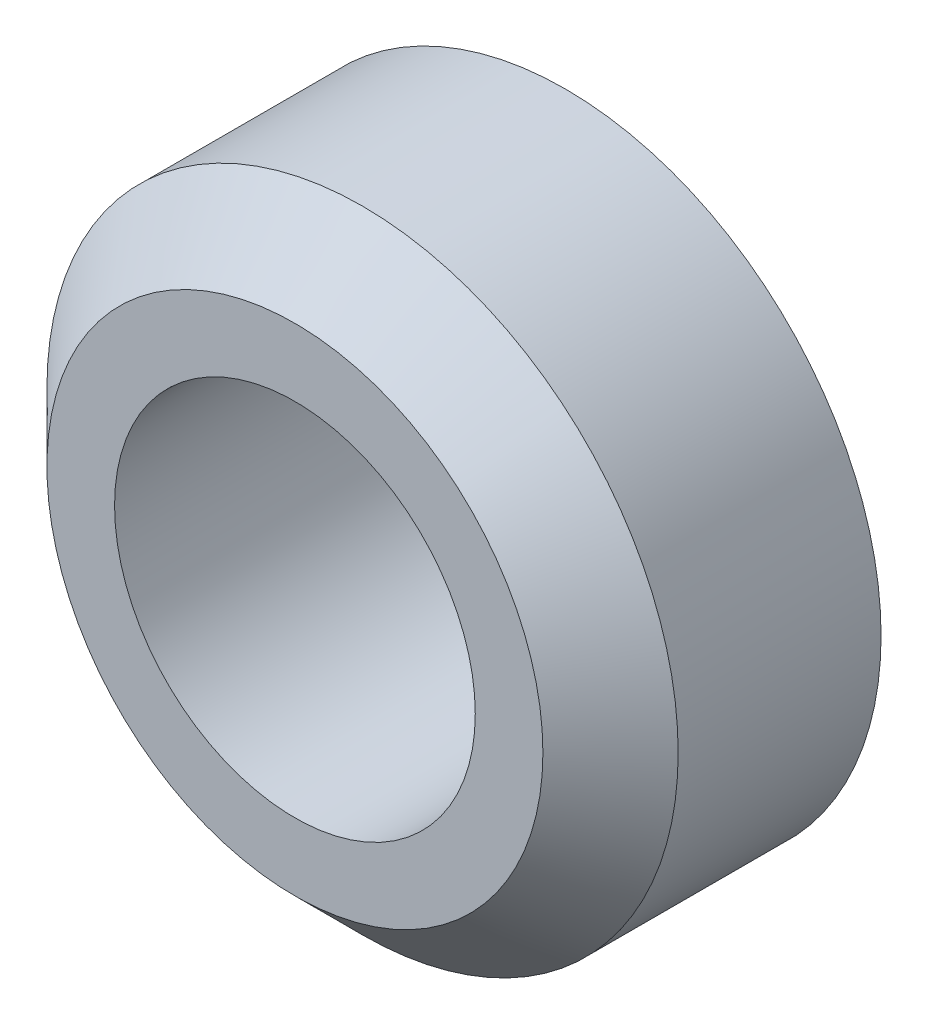
ISO-10303-21;
HEADER;
FILE_DESCRIPTION(('STEP AP214'),'2;1');
FILE_NAME('part.step','',(''),(''),'','','');
FILE_SCHEMA(('AUTOMOTIVE_DESIGN { 1 0 10303 214 1 1 1 1 }'));
ENDSEC;
DATA;
#1=APPLICATION_CONTEXT('core data for automotive mechanical design processes');
#2=APPLICATION_PROTOCOL_DEFINITION('international standard','automotive_design',2000,#1);
#3=PRODUCT_CONTEXT('',#1,'mechanical');
#4=PRODUCT('Part','Part','',(#3));
#5=PRODUCT_RELATED_PRODUCT_CATEGORY('part','',(#4));
#6=PRODUCT_DEFINITION_FORMATION('','',#4);
#7=PRODUCT_DEFINITION_CONTEXT('part definition',#1,'design');
#8=PRODUCT_DEFINITION('design','',#6,#7);
#9=PRODUCT_DEFINITION_SHAPE('','',#8);
#10=(LENGTH_UNIT() NAMED_UNIT(*) SI_UNIT(.MILLI.,.METRE.));
#11=(NAMED_UNIT(*) PLANE_ANGLE_UNIT() SI_UNIT($,.RADIAN.));
#12=(NAMED_UNIT(*) SI_UNIT($,.STERADIAN.) SOLID_ANGLE_UNIT());
#13=UNCERTAINTY_MEASURE_WITH_UNIT(LENGTH_MEASURE(1.E-05),#10,'distance_accuracy_value','');
#14=(GEOMETRIC_REPRESENTATION_CONTEXT(3) GLOBAL_UNCERTAINTY_ASSIGNED_CONTEXT((#13)) GLOBAL_UNIT_ASSIGNED_CONTEXT((#10,
#11,#12)) REPRESENTATION_CONTEXT('',''));
#15=CARTESIAN_POINT('',(0.,0.,0.));
#16=DIRECTION('',(0.,0.,1.));
#17=DIRECTION('',(1.,0.,0.));
#18=AXIS2_PLACEMENT_3D('',#15,#16,#17);
#19=CARTESIAN_POINT('',(0.,0.,6.));
#20=DIRECTION('',(0.,0.,1.));
#21=DIRECTION('',(1.,0.,0.));
#22=AXIS2_PLACEMENT_3D('',#19,#20,#21);
#23=PLANE('',#22);
#24=CARTESIAN_POINT('',(0.,0.,6.));
#25=DIRECTION('',(0.,0.,1.));
#26=DIRECTION('',(1.,0.,0.));
#27=AXIS2_PLACEMENT_3D('',#24,#25,#26);
#28=CIRCLE('',#27,5.5);
#29=CARTESIAN_POINT('',(5.5,0.,6.));
#30=VERTEX_POINT('',#29);
#31=EDGE_CURVE('E37',#30,#30,#28,.T.);
#32=ORIENTED_EDGE('',*,*,#31,.T.);
#33=EDGE_LOOP('',(#32));
#34=FACE_BOUND('',#33,.T.);
#35=CARTESIAN_POINT('',(0.,0.,6.));
#36=DIRECTION('',(0.,0.,1.));
#37=DIRECTION('',(1.,0.,0.));
#38=AXIS2_PLACEMENT_3D('',#35,#36,#37);
#39=CIRCLE('',#38,4.);
#40=CARTESIAN_POINT('',(4.,0.,6.));
#41=VERTEX_POINT('',#40);
#42=EDGE_CURVE('E45',#41,#41,#39,.T.);
#43=ORIENTED_EDGE('',*,*,#42,.F.);
#44=EDGE_LOOP('',(#43));
#45=FACE_BOUND('',#44,.T.);
#46=ADVANCED_FACE('F30',(#34,#45),#23,.T.);
#47=CARTESIAN_POINT('',(0.,0.,0.));
#48=DIRECTION('',(0.,0.,1.));
#49=DIRECTION('',(1.,0.,0.));
#50=AXIS2_PLACEMENT_3D('',#47,#48,#49);
#51=PLANE('',#50);
#52=CARTESIAN_POINT('',(0.,0.,0.));
#53=DIRECTION('',(0.,0.,1.));
#54=DIRECTION('',(1.,0.,0.));
#55=AXIS2_PLACEMENT_3D('',#52,#53,#54);
#56=CIRCLE('',#55,7.);
#57=CARTESIAN_POINT('',(7.,0.,0.));
#58=VERTEX_POINT('',#57);
#59=EDGE_CURVE('E41',#58,#58,#56,.T.);
#60=ORIENTED_EDGE('',*,*,#59,.F.);
#61=EDGE_LOOP('',(#60));
#62=FACE_BOUND('',#61,.T.);
#63=CARTESIAN_POINT('',(0.,0.,0.));
#64=DIRECTION('',(0.,0.,1.));
#65=DIRECTION('',(1.,0.,0.));
#66=AXIS2_PLACEMENT_3D('',#63,#64,#65);
#67=CIRCLE('',#66,4.);
#68=CARTESIAN_POINT('',(4.,0.,0.));
#69=VERTEX_POINT('',#68);
#70=EDGE_CURVE('E48',#69,#69,#67,.T.);
#71=ORIENTED_EDGE('',*,*,#70,.T.);
#72=EDGE_LOOP('',(#71));
#73=FACE_BOUND('',#72,.T.);
#74=ADVANCED_FACE('F58',(#62,#73),#51,.F.);
#75=CARTESIAN_POINT('',(0.,0.,6.));
#76=DIRECTION('',(0.,0.,-1.));
#77=DIRECTION('',(-1.,0.,0.));
#78=AXIS2_PLACEMENT_3D('',#75,#76,#77);
#79=CYLINDRICAL_SURFACE('',#78,7.);
#80=CARTESIAN_POINT('',(0.,0.,4.49999999999999));
#81=DIRECTION('',(0.,0.,1.));
#82=DIRECTION('',(1.,0.,0.));
#83=AXIS2_PLACEMENT_3D('',#80,#81,#82);
#84=CIRCLE('',#83,7.);
#85=CARTESIAN_POINT('',(7.,0.,4.49999999999999));
#86=VERTEX_POINT('',#85);
#87=EDGE_CURVE('E10',#86,#86,#84,.F.);
#88=ORIENTED_EDGE('',*,*,#87,.T.);
#89=EDGE_LOOP('',(#88));
#90=FACE_BOUND('',#89,.T.);
#91=ORIENTED_EDGE('',*,*,#59,.T.);
#92=EDGE_LOOP('',(#91));
#93=FACE_BOUND('',#92,.T.);
#94=ADVANCED_FACE('F63',(#90,#93),#79,.T.);
#95=CARTESIAN_POINT('',(0.,0.,6.));
#96=DIRECTION('',(0.,0.,-1.));
#97=DIRECTION('',(-1.,0.,0.));
#98=AXIS2_PLACEMENT_3D('',#95,#96,#97);
#99=CYLINDRICAL_SURFACE('',#98,4.);
#100=ORIENTED_EDGE('',*,*,#42,.T.);
#101=EDGE_LOOP('',(#100));
#102=FACE_BOUND('',#101,.T.);
#103=ORIENTED_EDGE('',*,*,#70,.F.);
#104=EDGE_LOOP('',(#103));
#105=FACE_BOUND('',#104,.T.);
#106=ADVANCED_FACE('F54',(#102,#105),#99,.F.);
#107=CARTESIAN_POINT('',(0.,0.,6.));
#108=DIRECTION('',(0.,0.,-1.));
#109=DIRECTION('',(-1.,0.,0.));
#110=AXIS2_PLACEMENT_3D('',#107,#108,#109);
#111=CONICAL_SURFACE('',#110,5.5,0.785398163397446);
#112=ORIENTED_EDGE('',*,*,#87,.F.);
#113=EDGE_LOOP('',(#112));
#114=FACE_BOUND('',#113,.T.);
#115=ORIENTED_EDGE('',*,*,#31,.F.);
#116=EDGE_LOOP('',(#115));
#117=FACE_BOUND('',#116,.T.);
#118=ADVANCED_FACE('F32',(#114,#117),#111,.T.);
#119=CLOSED_SHELL('',(#46,#74,#94,#106,#118));
#120=MANIFOLD_SOLID_BREP('B2',#119);
#121=ADVANCED_BREP_SHAPE_REPRESENTATION('',(#18,#120),#14);
#122=SHAPE_DEFINITION_REPRESENTATION(#9,#121);
ENDSEC;
END-ISO-10303-21;
